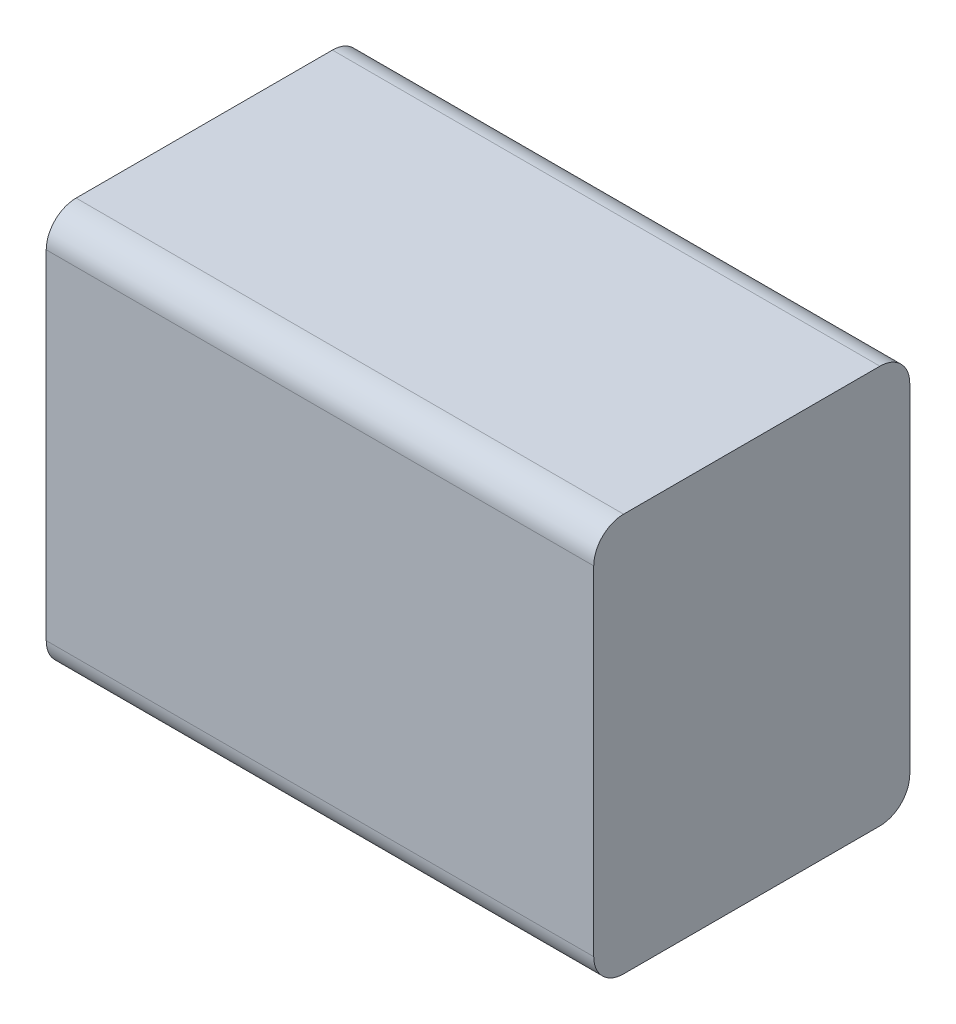
ISO-10303-21;
HEADER;
FILE_DESCRIPTION(('STEP AP214'),'2;1');
FILE_NAME('part.step','',(''),(''),'','','');
FILE_SCHEMA(('AUTOMOTIVE_DESIGN { 1 0 10303 214 1 1 1 1 }'));
ENDSEC;
DATA;
#1=APPLICATION_CONTEXT('core data for automotive mechanical design processes');
#2=APPLICATION_PROTOCOL_DEFINITION('international standard','automotive_design',2000,#1);
#3=PRODUCT_CONTEXT('',#1,'mechanical');
#4=PRODUCT('Part','Part','',(#3));
#5=PRODUCT_RELATED_PRODUCT_CATEGORY('part','',(#4));
#6=PRODUCT_DEFINITION_FORMATION('','',#4);
#7=PRODUCT_DEFINITION_CONTEXT('part definition',#1,'design');
#8=PRODUCT_DEFINITION('design','',#6,#7);
#9=PRODUCT_DEFINITION_SHAPE('','',#8);
#10=(LENGTH_UNIT() NAMED_UNIT(*) SI_UNIT(.MILLI.,.METRE.));
#11=(NAMED_UNIT(*) PLANE_ANGLE_UNIT() SI_UNIT($,.RADIAN.));
#12=(NAMED_UNIT(*) SI_UNIT($,.STERADIAN.) SOLID_ANGLE_UNIT());
#13=UNCERTAINTY_MEASURE_WITH_UNIT(LENGTH_MEASURE(1.E-05),#10,'distance_accuracy_value','');
#14=(GEOMETRIC_REPRESENTATION_CONTEXT(3) GLOBAL_UNCERTAINTY_ASSIGNED_CONTEXT((#13)) GLOBAL_UNIT_ASSIGNED_CONTEXT((#10,
#11,#12)) REPRESENTATION_CONTEXT('',''));
#15=CARTESIAN_POINT('',(0.,0.,0.));
#16=DIRECTION('',(0.,0.,1.));
#17=DIRECTION('',(1.,0.,0.));
#18=AXIS2_PLACEMENT_3D('',#15,#16,#17);
#19=CARTESIAN_POINT('',(-1.1,0.,0.635));
#20=DIRECTION('',(1.,0.,0.));
#21=DIRECTION('',(0.,1.,0.));
#22=AXIS2_PLACEMENT_3D('',#19,#20,#21);
#23=PLANE('',#22);
#24=CARTESIAN_POINT('',(-1.1,-0.68,1.15));
#25=DIRECTION('',(-1.,0.,0.));
#26=DIRECTION('',(0.,0.,1.));
#27=AXIS2_PLACEMENT_3D('',#24,#25,#26);
#28=CIRCLE('',#27,0.12);
#29=CARTESIAN_POINT('',(-1.1,-0.8,1.15));
#30=VERTEX_POINT('',#29);
#31=CARTESIAN_POINT('',(-1.1,-0.68,1.27));
#32=VERTEX_POINT('',#31);
#33=EDGE_CURVE('E11',#30,#32,#28,.T.);
#34=ORIENTED_EDGE('',*,*,#33,.T.);
#35=DIRECTION('',(0.,1.,0.));
#36=VECTOR('',#35,1.);
#37=CARTESIAN_POINT('',(-1.1,0.68,1.27));
#38=LINE('',#37,#36);
#39=CARTESIAN_POINT('',(-1.1,0.68,1.27));
#40=VERTEX_POINT('',#39);
#41=EDGE_CURVE('E133',#32,#40,#38,.T.);
#42=ORIENTED_EDGE('',*,*,#41,.T.);
#43=CARTESIAN_POINT('',(-1.1,0.68,1.15));
#44=DIRECTION('',(-1.,0.,0.));
#45=DIRECTION('',(0.,1.,0.));
#46=AXIS2_PLACEMENT_3D('',#43,#44,#45);
#47=CIRCLE('',#46,0.12);
#48=CARTESIAN_POINT('',(-1.1,0.8,1.15));
#49=VERTEX_POINT('',#48);
#50=EDGE_CURVE('E86',#40,#49,#47,.T.);
#51=ORIENTED_EDGE('',*,*,#50,.T.);
#52=DIRECTION('',(0.,0.,-1.));
#53=VECTOR('',#52,1.);
#54=CARTESIAN_POINT('',(-1.1,0.8,0.12));
#55=LINE('',#54,#53);
#56=CARTESIAN_POINT('',(-1.1,0.8,0.12));
#57=VERTEX_POINT('',#56);
#58=EDGE_CURVE('E91',#49,#57,#55,.T.);
#59=ORIENTED_EDGE('',*,*,#58,.T.);
#60=CARTESIAN_POINT('',(-1.1,0.68,0.12));
#61=DIRECTION('',(-1.,0.,0.));
#62=DIRECTION('',(0.,0.,-1.));
#63=AXIS2_PLACEMENT_3D('',#60,#61,#62);
#64=CIRCLE('',#63,0.12);
#65=CARTESIAN_POINT('',(-1.1,0.68,0.));
#66=VERTEX_POINT('',#65);
#67=EDGE_CURVE('E94',#57,#66,#64,.T.);
#68=ORIENTED_EDGE('',*,*,#67,.T.);
#69=DIRECTION('',(0.,-1.,0.));
#70=VECTOR('',#69,1.);
#71=CARTESIAN_POINT('',(-1.1,-0.68,0.));
#72=LINE('',#71,#70);
#73=CARTESIAN_POINT('',(-1.1,-0.68,0.));
#74=VERTEX_POINT('',#73);
#75=EDGE_CURVE('E119',#66,#74,#72,.T.);
#76=ORIENTED_EDGE('',*,*,#75,.T.);
#77=CARTESIAN_POINT('',(-1.1,-0.68,0.12));
#78=DIRECTION('',(-1.,0.,0.));
#79=DIRECTION('',(0.,-1.,0.));
#80=AXIS2_PLACEMENT_3D('',#77,#78,#79);
#81=CIRCLE('',#80,0.12);
#82=CARTESIAN_POINT('',(-1.1,-0.8,0.12));
#83=VERTEX_POINT('',#82);
#84=EDGE_CURVE('E181',#74,#83,#81,.T.);
#85=ORIENTED_EDGE('',*,*,#84,.T.);
#86=DIRECTION('',(0.,0.,1.));
#87=VECTOR('',#86,1.);
#88=CARTESIAN_POINT('',(-1.1,-0.8,1.15));
#89=LINE('',#88,#87);
#90=EDGE_CURVE('E172',#83,#30,#89,.T.);
#91=ORIENTED_EDGE('',*,*,#90,.T.);
#92=EDGE_LOOP('',(#34,#42,#51,#59,#68,#76,#85,#91));
#93=FACE_BOUND('',#92,.T.);
#94=ADVANCED_FACE('F17',(#93),#23,.F.);
#95=CARTESIAN_POINT('',(0.,-0.68,1.15));
#96=DIRECTION('',(-1.,0.,0.));
#97=DIRECTION('',(0.,0.,1.));
#98=AXIS2_PLACEMENT_3D('',#95,#96,#97);
#99=CYLINDRICAL_SURFACE('',#98,0.12);
#100=DIRECTION('',(-1.,0.,0.));
#101=VECTOR('',#100,1.);
#102=CARTESIAN_POINT('',(0.,-0.68,1.27));
#103=LINE('',#102,#101);
#104=CARTESIAN_POINT('',(1.1,-0.68,1.27));
#105=VERTEX_POINT('',#104);
#106=EDGE_CURVE('E26',#105,#32,#103,.T.);
#107=ORIENTED_EDGE('',*,*,#106,.T.);
#108=ORIENTED_EDGE('',*,*,#33,.F.);
#109=DIRECTION('',(1.,0.,0.));
#110=VECTOR('',#109,1.);
#111=CARTESIAN_POINT('',(0.,-0.8,1.15));
#112=LINE('',#111,#110);
#113=CARTESIAN_POINT('',(1.1,-0.8,1.15));
#114=VERTEX_POINT('',#113);
#115=EDGE_CURVE('E174',#30,#114,#112,.T.);
#116=ORIENTED_EDGE('',*,*,#115,.T.);
#117=CARTESIAN_POINT('',(1.1,-0.68,1.15));
#118=DIRECTION('',(1.,0.,0.));
#119=DIRECTION('',(0.,0.,1.));
#120=AXIS2_PLACEMENT_3D('',#117,#118,#119);
#121=CIRCLE('',#120,0.12);
#122=EDGE_CURVE('E146',#105,#114,#121,.T.);
#123=ORIENTED_EDGE('',*,*,#122,.F.);
#124=EDGE_LOOP('',(#107,#108,#116,#123));
#125=FACE_BOUND('',#124,.T.);
#126=ADVANCED_FACE('F142',(#125),#99,.T.);
#127=CARTESIAN_POINT('',(0.,-0.68,1.27));
#128=DIRECTION('',(0.,0.,1.));
#129=DIRECTION('',(1.,0.,0.));
#130=AXIS2_PLACEMENT_3D('',#127,#128,#129);
#131=PLANE('',#130);
#132=DIRECTION('',(1.,0.,0.));
#133=VECTOR('',#132,1.);
#134=CARTESIAN_POINT('',(0.,0.68,1.27));
#135=LINE('',#134,#133);
#136=CARTESIAN_POINT('',(1.1,0.68,1.27));
#137=VERTEX_POINT('',#136);
#138=EDGE_CURVE('E129',#40,#137,#135,.T.);
#139=ORIENTED_EDGE('',*,*,#138,.F.);
#140=ORIENTED_EDGE('',*,*,#41,.F.);
#141=ORIENTED_EDGE('',*,*,#106,.F.);
#142=DIRECTION('',(0.,-1.,0.));
#143=VECTOR('',#142,1.);
#144=CARTESIAN_POINT('',(1.1,0.68,1.27));
#145=LINE('',#144,#143);
#146=EDGE_CURVE('E152',#137,#105,#145,.T.);
#147=ORIENTED_EDGE('',*,*,#146,.F.);
#148=EDGE_LOOP('',(#139,#140,#141,#147));
#149=FACE_BOUND('',#148,.T.);
#150=ADVANCED_FACE('F151',(#149),#131,.T.);
#151=CARTESIAN_POINT('',(0.,0.68,1.15));
#152=DIRECTION('',(-1.,0.,0.));
#153=DIRECTION('',(0.,1.,0.));
#154=AXIS2_PLACEMENT_3D('',#151,#152,#153);
#155=CYLINDRICAL_SURFACE('',#154,0.12);
#156=DIRECTION('',(1.,0.,0.));
#157=VECTOR('',#156,1.);
#158=CARTESIAN_POINT('',(0.,0.8,1.15));
#159=LINE('',#158,#157);
#160=CARTESIAN_POINT('',(1.1,0.8,1.15));
#161=VERTEX_POINT('',#160);
#162=EDGE_CURVE('E98',#49,#161,#159,.T.);
#163=ORIENTED_EDGE('',*,*,#162,.F.);
#164=ORIENTED_EDGE('',*,*,#50,.F.);
#165=ORIENTED_EDGE('',*,*,#138,.T.);
#166=CARTESIAN_POINT('',(1.1,0.68,1.15));
#167=DIRECTION('',(1.,0.,0.));
#168=DIRECTION('',(0.,1.,0.));
#169=AXIS2_PLACEMENT_3D('',#166,#167,#168);
#170=CIRCLE('',#169,0.12);
#171=EDGE_CURVE('E157',#161,#137,#170,.T.);
#172=ORIENTED_EDGE('',*,*,#171,.F.);
#173=EDGE_LOOP('',(#163,#164,#165,#172));
#174=FACE_BOUND('',#173,.T.);
#175=ADVANCED_FACE('F156',(#174),#155,.T.);
#176=CARTESIAN_POINT('',(0.,0.8,1.15));
#177=DIRECTION('',(0.,1.,0.));
#178=DIRECTION('',(0.,0.,-1.));
#179=AXIS2_PLACEMENT_3D('',#176,#177,#178);
#180=PLANE('',#179);
#181=DIRECTION('',(1.,0.,0.));
#182=VECTOR('',#181,1.);
#183=CARTESIAN_POINT('',(0.,0.8,0.12));
#184=LINE('',#183,#182);
#185=CARTESIAN_POINT('',(1.1,0.8,0.12));
#186=VERTEX_POINT('',#185);
#187=EDGE_CURVE('E99',#57,#186,#184,.T.);
#188=ORIENTED_EDGE('',*,*,#187,.F.);
#189=ORIENTED_EDGE('',*,*,#58,.F.);
#190=ORIENTED_EDGE('',*,*,#162,.T.);
#191=DIRECTION('',(0.,0.,1.));
#192=VECTOR('',#191,1.);
#193=CARTESIAN_POINT('',(1.1,0.8,0.12));
#194=LINE('',#193,#192);
#195=EDGE_CURVE('E104',#186,#161,#194,.T.);
#196=ORIENTED_EDGE('',*,*,#195,.F.);
#197=EDGE_LOOP('',(#188,#189,#190,#196));
#198=FACE_BOUND('',#197,.T.);
#199=ADVANCED_FACE('F102',(#198),#180,.T.);
#200=CARTESIAN_POINT('',(0.,0.68,0.12));
#201=DIRECTION('',(-1.,0.,0.));
#202=DIRECTION('',(0.,0.,-1.));
#203=AXIS2_PLACEMENT_3D('',#200,#201,#202);
#204=CYLINDRICAL_SURFACE('',#203,0.12);
#205=DIRECTION('',(1.,0.,0.));
#206=VECTOR('',#205,1.);
#207=CARTESIAN_POINT('',(0.,0.68,0.));
#208=LINE('',#207,#206);
#209=CARTESIAN_POINT('',(1.1,0.68,0.));
#210=VERTEX_POINT('',#209);
#211=EDGE_CURVE('E111',#66,#210,#208,.T.);
#212=ORIENTED_EDGE('',*,*,#211,.F.);
#213=ORIENTED_EDGE('',*,*,#67,.F.);
#214=ORIENTED_EDGE('',*,*,#187,.T.);
#215=CARTESIAN_POINT('',(1.1,0.68,0.12));
#216=DIRECTION('',(1.,0.,0.));
#217=DIRECTION('',(0.,0.,-1.));
#218=AXIS2_PLACEMENT_3D('',#215,#216,#217);
#219=CIRCLE('',#218,0.12);
#220=EDGE_CURVE('E163',#210,#186,#219,.T.);
#221=ORIENTED_EDGE('',*,*,#220,.F.);
#222=EDGE_LOOP('',(#212,#213,#214,#221));
#223=FACE_BOUND('',#222,.T.);
#224=ADVANCED_FACE('F110',(#223),#204,.T.);
#225=CARTESIAN_POINT('',(0.,0.68,0.));
#226=DIRECTION('',(0.,0.,-1.));
#227=DIRECTION('',(0.,-1.,0.));
#228=AXIS2_PLACEMENT_3D('',#225,#226,#227);
#229=PLANE('',#228);
#230=DIRECTION('',(1.,0.,0.));
#231=VECTOR('',#230,1.);
#232=CARTESIAN_POINT('',(0.,-0.68,0.));
#233=LINE('',#232,#231);
#234=CARTESIAN_POINT('',(1.1,-0.68,0.));
#235=VERTEX_POINT('',#234);
#236=EDGE_CURVE('E190',#74,#235,#233,.T.);
#237=ORIENTED_EDGE('',*,*,#236,.F.);
#238=ORIENTED_EDGE('',*,*,#75,.F.);
#239=ORIENTED_EDGE('',*,*,#211,.T.);
#240=DIRECTION('',(0.,1.,0.));
#241=VECTOR('',#240,1.);
#242=CARTESIAN_POINT('',(1.1,-0.68,0.));
#243=LINE('',#242,#241);
#244=EDGE_CURVE('E169',#235,#210,#243,.T.);
#245=ORIENTED_EDGE('',*,*,#244,.F.);
#246=EDGE_LOOP('',(#237,#238,#239,#245));
#247=FACE_BOUND('',#246,.T.);
#248=ADVANCED_FACE('F216',(#247),#229,.T.);
#249=CARTESIAN_POINT('',(0.,-0.68,0.12));
#250=DIRECTION('',(-1.,0.,0.));
#251=DIRECTION('',(0.,-1.,0.));
#252=AXIS2_PLACEMENT_3D('',#249,#250,#251);
#253=CYLINDRICAL_SURFACE('',#252,0.12);
#254=DIRECTION('',(1.,0.,0.));
#255=VECTOR('',#254,1.);
#256=CARTESIAN_POINT('',(0.,-0.8,0.12));
#257=LINE('',#256,#255);
#258=CARTESIAN_POINT('',(1.1,-0.8,0.12));
#259=VERTEX_POINT('',#258);
#260=EDGE_CURVE('E123',#83,#259,#257,.T.);
#261=ORIENTED_EDGE('',*,*,#260,.F.);
#262=ORIENTED_EDGE('',*,*,#84,.F.);
#263=ORIENTED_EDGE('',*,*,#236,.T.);
#264=CARTESIAN_POINT('',(1.1,-0.68,0.12));
#265=DIRECTION('',(1.,0.,0.));
#266=DIRECTION('',(0.,-1.,0.));
#267=AXIS2_PLACEMENT_3D('',#264,#265,#266);
#268=CIRCLE('',#267,0.12);
#269=EDGE_CURVE('E193',#259,#235,#268,.T.);
#270=ORIENTED_EDGE('',*,*,#269,.F.);
#271=EDGE_LOOP('',(#261,#262,#263,#270));
#272=FACE_BOUND('',#271,.T.);
#273=ADVANCED_FACE('F214',(#272),#253,.T.);
#274=CARTESIAN_POINT('',(0.,-0.8,0.12));
#275=DIRECTION('',(0.,-1.,0.));
#276=DIRECTION('',(-1.,0.,0.));
#277=AXIS2_PLACEMENT_3D('',#274,#275,#276);
#278=PLANE('',#277);
#279=ORIENTED_EDGE('',*,*,#115,.F.);
#280=ORIENTED_EDGE('',*,*,#90,.F.);
#281=ORIENTED_EDGE('',*,*,#260,.T.);
#282=DIRECTION('',(0.,0.,-1.));
#283=VECTOR('',#282,1.);
#284=CARTESIAN_POINT('',(1.1,-0.8,1.15));
#285=LINE('',#284,#283);
#286=EDGE_CURVE('E197',#114,#259,#285,.T.);
#287=ORIENTED_EDGE('',*,*,#286,.F.);
#288=EDGE_LOOP('',(#279,#280,#281,#287));
#289=FACE_BOUND('',#288,.T.);
#290=ADVANCED_FACE('F218',(#289),#278,.T.);
#291=CARTESIAN_POINT('',(1.1,0.,0.635));
#292=DIRECTION('',(1.,0.,0.));
#293=DIRECTION('',(0.,1.,0.));
#294=AXIS2_PLACEMENT_3D('',#291,#292,#293);
#295=PLANE('',#294);
#296=ORIENTED_EDGE('',*,*,#122,.T.);
#297=ORIENTED_EDGE('',*,*,#286,.T.);
#298=ORIENTED_EDGE('',*,*,#269,.T.);
#299=ORIENTED_EDGE('',*,*,#244,.T.);
#300=ORIENTED_EDGE('',*,*,#220,.T.);
#301=ORIENTED_EDGE('',*,*,#195,.T.);
#302=ORIENTED_EDGE('',*,*,#171,.T.);
#303=ORIENTED_EDGE('',*,*,#146,.T.);
#304=EDGE_LOOP('',(#296,#297,#298,#299,#300,#301,#302,#303));
#305=FACE_BOUND('',#304,.T.);
#306=ADVANCED_FACE('F161',(#305),#295,.T.);
#307=CLOSED_SHELL('',(#94,#126,#150,#175,#199,#224,#248,#273,#290,#306));
#308=MANIFOLD_SOLID_BREP('B1',#307);
#309=ADVANCED_BREP_SHAPE_REPRESENTATION('',(#18,#308),#14);
#310=SHAPE_DEFINITION_REPRESENTATION(#9,#309);
ENDSEC;
END-ISO-10303-21;
